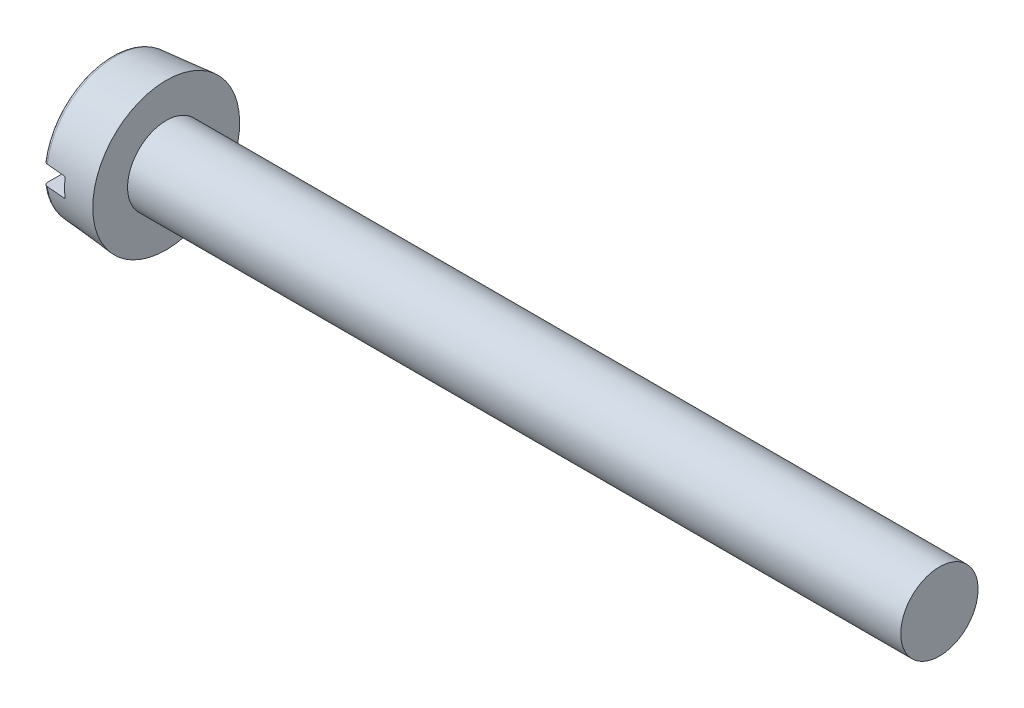
ISO-10303-21;
HEADER;
FILE_DESCRIPTION(('STEP AP214'),'2;1');
FILE_NAME('part.step','',(''),(''),'','','');
FILE_SCHEMA(('AUTOMOTIVE_DESIGN { 1 0 10303 214 1 1 1 1 }'));
ENDSEC;
DATA;
#1=APPLICATION_CONTEXT('core data for automotive mechanical design processes');
#2=APPLICATION_PROTOCOL_DEFINITION('international standard','automotive_design',2000,#1);
#3=PRODUCT_CONTEXT('',#1,'mechanical');
#4=PRODUCT('Part','Part','',(#3));
#5=PRODUCT_RELATED_PRODUCT_CATEGORY('part','',(#4));
#6=PRODUCT_DEFINITION_FORMATION('','',#4);
#7=PRODUCT_DEFINITION_CONTEXT('part definition',#1,'design');
#8=PRODUCT_DEFINITION('design','',#6,#7);
#9=PRODUCT_DEFINITION_SHAPE('','',#8);
#10=(LENGTH_UNIT() NAMED_UNIT(*) SI_UNIT(.MILLI.,.METRE.));
#11=(NAMED_UNIT(*) PLANE_ANGLE_UNIT() SI_UNIT($,.RADIAN.));
#12=(NAMED_UNIT(*) SI_UNIT($,.STERADIAN.) SOLID_ANGLE_UNIT());
#13=UNCERTAINTY_MEASURE_WITH_UNIT(LENGTH_MEASURE(1.E-05),#10,'distance_accuracy_value','');
#14=(GEOMETRIC_REPRESENTATION_CONTEXT(3) GLOBAL_UNCERTAINTY_ASSIGNED_CONTEXT((#13)) GLOBAL_UNIT_ASSIGNED_CONTEXT((#10,
#11,#12)) REPRESENTATION_CONTEXT('',''));
#15=CARTESIAN_POINT('',(0.,0.,0.));
#16=DIRECTION('',(0.,0.,1.));
#17=DIRECTION('',(1.,0.,0.));
#18=AXIS2_PLACEMENT_3D('',#15,#16,#17);
#19=CARTESIAN_POINT('',(0.,0.,0.));
#20=DIRECTION('',(-1.,0.,0.));
#21=DIRECTION('',(0.,0.,1.));
#22=AXIS2_PLACEMENT_3D('',#19,#20,#21);
#23=PLANE('',#22);
#24=DIRECTION('',(0.,0.,-1.));
#25=VECTOR('',#24,1.);
#26=CARTESIAN_POINT('',(0.,0.249999999999999,1.9));
#27=LINE('',#26,#25);
#28=CARTESIAN_POINT('',(0.,0.249999999999999,1.66724343126457));
#29=VERTEX_POINT('',#28);
#30=CARTESIAN_POINT('',(0.,0.249999999999999,-1.66724343126457));
#31=VERTEX_POINT('',#30);
#32=EDGE_CURVE('E103',#29,#31,#27,.T.);
#33=ORIENTED_EDGE('',*,*,#32,.F.);
#34=CARTESIAN_POINT('',(0.,0.,0.));
#35=DIRECTION('',(-1.,0.,0.));
#36=DIRECTION('',(0.,0.,1.));
#37=AXIS2_PLACEMENT_3D('',#34,#35,#36);
#38=CIRCLE('',#37,1.68588275366196);
#39=EDGE_CURVE('E105',#29,#31,#38,.T.);
#40=ORIENTED_EDGE('',*,*,#39,.T.);
#41=EDGE_LOOP('',(#33,#40));
#42=FACE_BOUND('',#41,.T.);
#43=ADVANCED_FACE('F35',(#42),#23,.T.);
#44=CARTESIAN_POINT('',(0.1,0.,0.));
#45=DIRECTION('',(-1.,0.,0.));
#46=DIRECTION('',(0.,0.,1.));
#47=AXIS2_PLACEMENT_3D('',#44,#45,#46);
#48=TOROIDAL_SURFACE('',#47,1.68588275366196,0.1);
#49=CARTESIAN_POINT('',(0.0301239837184532,0.249999999999999,-1.73954570987134));
#50=CARTESIAN_POINT('',(0.0341122540256556,0.249999999999999,-1.74348114703534));
#51=CARTESIAN_POINT('',(0.0384332916495913,0.249999999999999,-1.74708479745269));
#52=CARTESIAN_POINT('',(0.0476215968885684,0.249999999999999,-1.75351988324919));
#53=CARTESIAN_POINT('',(0.0524894518418908,0.249999999999999,-1.75635047687334));
#54=CARTESIAN_POINT('',(0.0626321269057785,0.249999999999999,-1.7611518726827));
#55=CARTESIAN_POINT('',(0.0679068945512793,0.249999999999999,-1.76312278549305));
#56=CARTESIAN_POINT('',(0.078712245471321,0.249999999999999,-1.76614517825523));
#57=CARTESIAN_POINT('',(0.0842427666888282,0.249999999999999,-1.76719688002821));
#58=CARTESIAN_POINT('',(0.0953733944439474,0.249999999999999,-1.76834695503076));
#59=CARTESIAN_POINT('',(0.100972999637237,0.249999999999999,-1.76845018239128));
#60=CARTESIAN_POINT('',(0.112109811915657,0.249999999999999,-1.76771285537891));
#61=CARTESIAN_POINT('',(0.117647018058241,0.249999999999999,-1.76687228676909));
#62=CARTESIAN_POINT('',(0.128489803717953,0.249999999999999,-1.76427538353904));
#63=CARTESIAN_POINT('',(0.133795848010852,0.249999999999999,-1.76252098799906));
#64=CARTESIAN_POINT('',(0.14403973031954,0.249999999999999,-1.75814968615088));
#65=CARTESIAN_POINT('',(0.148977564711526,0.249999999999999,-1.75553277135543));
#66=CARTESIAN_POINT('',(0.158366741694691,0.249999999999999,-1.74950124280131));
#67=CARTESIAN_POINT('',(0.162816088565464,0.249999999999999,-1.74608352334629));
#68=CARTESIAN_POINT('',(0.171083921068067,0.249999999999999,-1.73855542384798));
#69=CARTESIAN_POINT('',(0.174902382724926,0.249999999999999,-1.73444501749311));
#70=CARTESIAN_POINT('',(0.181835504151915,0.249999999999999,-1.72561114445745));
#71=CARTESIAN_POINT('',(0.184943867145123,0.249999999999999,-1.72088273649891));
#72=CARTESIAN_POINT('',(0.190331805109599,0.249999999999999,-1.71097526726483));
#73=CARTESIAN_POINT('',(0.19261133485436,0.249999999999999,-1.7057961814165));
#74=CARTESIAN_POINT('',(0.196300503462131,0.249999999999999,-1.69507883946751));
#75=CARTESIAN_POINT('',(0.197701208750648,0.249999999999999,-1.68953750769915));
#76=CARTESIAN_POINT('',(0.199560107931746,0.249999999999999,-1.67829891478366));
#77=CARTESIAN_POINT('',(0.2000182569785,0.249999999999999,-1.67260164623029));
#78=CARTESIAN_POINT('',(0.199980488082452,0.249999999999999,-1.66116755240173));
#79=CARTESIAN_POINT('',(0.199477416691626,0.249999999999999,-1.65543074959807));
#80=CARTESIAN_POINT('',(0.197516883099685,0.249999999999999,-1.64412247089109));
#81=CARTESIAN_POINT('',(0.19605940106392,0.249999999999999,-1.6385509984262));
#82=CARTESIAN_POINT('',(0.192226434881595,0.249999999999999,-1.62772407078967));
#83=CARTESIAN_POINT('',(0.189849634285873,0.249999999999999,-1.62246908134511));
#84=CARTESIAN_POINT('',(0.184242507962168,0.249999999999999,-1.61243590232117));
#85=CARTESIAN_POINT('',(0.181012200803495,0.249999999999999,-1.60765770237164));
#86=CARTESIAN_POINT('',(0.173808398364609,0.249999999999999,-1.59874552852762));
#87=CARTESIAN_POINT('',(0.16983941365434,0.249999999999999,-1.5946079100141));
#88=CARTESIAN_POINT('',(0.161256212040592,0.249999999999999,-1.58706689346002));
#89=CARTESIAN_POINT('',(0.156642033668646,0.249999999999999,-1.58366345160461));
#90=CARTESIAN_POINT('',(0.146954193747203,0.249999999999999,-1.577728304209));
#91=CARTESIAN_POINT('',(0.141886222152689,0.249999999999999,-1.5751873117397));
#92=CARTESIAN_POINT('',(0.131392256265676,0.249999999999999,-1.57100326499133));
#93=CARTESIAN_POINT('',(0.125966286684049,0.249999999999999,-1.5693601488087));
#94=CARTESIAN_POINT('',(0.114975418023078,0.249999999999999,-1.56703614777695));
#95=CARTESIAN_POINT('',(0.109412743361664,0.249999999999999,-1.56634473553344));
#96=CARTESIAN_POINT('',(0.0982506296477881,0.249999999999999,-1.56591134324024));
#97=CARTESIAN_POINT('',(0.0926511921124145,0.249999999999999,-1.56616932425487));
#98=CARTESIAN_POINT('',(0.0816068018037828,0.249999999999999,-1.56762261837648));
#99=CARTESIAN_POINT('',(0.0761611699810633,0.249999999999999,-1.56881278083001));
#100=CARTESIAN_POINT('',(0.0655461187744442,0.249999999999999,-1.57208782392461));
#101=CARTESIAN_POINT('',(0.0603767005480554,0.249999999999999,-1.5741727083148));
#102=CARTESIAN_POINT('',(0.0504429211594081,0.249999999999999,-1.57918218125947));
#103=CARTESIAN_POINT('',(0.045679818847784,0.249999999999999,-1.58210926476463));
#104=CARTESIAN_POINT('',(0.0367063855830659,0.249999999999999,-1.58871421123321));
#105=CARTESIAN_POINT('',(0.0324960808997949,0.249999999999999,-1.59239210985535));
#106=CARTESIAN_POINT('',(0.0247028499071556,0.249999999999999,-1.60043217731811));
#107=CARTESIAN_POINT('',(0.0211264966781281,0.249999999999999,-1.60480071638002));
#108=CARTESIAN_POINT('',(0.0147478039662305,0.249999999999999,-1.61407035663433));
#109=CARTESIAN_POINT('',(0.0119455146325412,0.249999999999999,-1.61897149230335));
#110=CARTESIAN_POINT('',(0.00716047536747489,0.249999999999999,-1.62922901712882));
#111=CARTESIAN_POINT('',(0.00518773010061188,0.249999999999999,-1.6345900743117));
#112=CARTESIAN_POINT('',(0.00216211004761507,0.249999999999999,-1.64556559292559));
#113=CARTESIAN_POINT('',(0.00110924708522798,0.249999999999999,-1.6511800576128));
#114=CARTESIAN_POINT('',(-5.33425649793595E-05,0.249999999999999,-1.66255157007252));
#115=CARTESIAN_POINT('',(-0.000155417619311162,0.249999999999999,-1.6683094013264));
#116=CARTESIAN_POINT('',(0.000607195995681335,0.249999999999999,-1.67976235656453));
#117=CARTESIAN_POINT('',(0.00147213868127252,0.249999999999999,-1.68545746367547));
#118=CARTESIAN_POINT('',(0.00414869895477077,0.249999999999999,-1.69663068032758));
#119=CARTESIAN_POINT('',(0.00596193608673409,0.249999999999999,-1.70210840133309));
#120=CARTESIAN_POINT('',(0.0104866705202584,0.249999999999999,-1.71267417663621));
#121=CARTESIAN_POINT('',(0.0131970742616457,0.249999999999999,-1.71776269608293));
#122=CARTESIAN_POINT('',(0.0183021368753957,0.249999999999999,-1.72564874312836));
#123=CARTESIAN_POINT('',(0.0204534266755835,0.249999999999999,-1.72860667972899));
#124=CARTESIAN_POINT('',(0.0250639712199927,0.249999999999999,-1.73427200964239));
#125=CARTESIAN_POINT('',(0.0275232249959109,0.249999999999999,-1.73697940374288));
#126=CARTESIAN_POINT('',(0.0301239837184532,0.249999999999999,-1.73954570987134));
#127=B_SPLINE_CURVE_WITH_KNOTS('',3,(#49,#50,#51,#52,#53,#54,#55,#56,#57,#58,#59,#60,#61,#62,
#63,#64,#65,#66,#67,#68,#69,#70,#71,#72,#73,#74,#75,#76,#77,#78,#79,#80,#81,#82,#83,#84,#85,#86,
#87,#88,#89,#90,#91,#92,#93,#94,#95,#96,#97,#98,#99,#100,#101,#102,#103,#104,#105,#106,#107,
#108,#109,#110,#111,#112,#113,#114,#115,#116,#117,#118,#119,#120,#121,#122,#123,#124,#125,#126),
.UNSPECIFIED.,.T.,.F.,(4,2,2,2,2,2,2,2,2,2,2,2,2,2,2,2,2,2,2,2,2,2,2,2,2,2,2,2,2,2,2,2,2,2,2,2,
2,2,4),(0.,0.0167959110445544,0.0336100383184082,0.0504220012837824,0.0672299061172488,
0.083951742734666,0.100673831600297,0.117360580985523,0.134047494574589,0.150800227323111,
0.16755359656452,0.184450209981753,0.201347745249247,0.21841437976708,0.235481826278521,
0.252676784421207,0.269872099922449,0.287092130544962,0.304311786550839,0.321429553193156,
0.338546297983667,0.355472401973107,0.372397338855157,0.389133511649821,0.405868998082989,
0.422512661437951,0.439156394534985,0.455849950224767,0.47254429893197,0.489402732254282,
0.506262257525773,0.523319657239103,0.540377276197228,0.557572051898691,0.574771345386106,
0.59200010906381,0.609207949388039,0.620160629655461,0.631113275486232),.UNSPECIFIED.);
#128=CARTESIAN_POINT('',(0.0912844257252368,0.249999999999999,-1.76791351316188));
#129=VERTEX_POINT('',#128);
#130=EDGE_CURVE('E59',#31,#129,#127,.T.);
#131=ORIENTED_EDGE('',*,*,#130,.F.);
#132=ORIENTED_EDGE('',*,*,#39,.F.);
#133=CARTESIAN_POINT('',(0.0384108200525432,0.249999999999999,1.58753563015566));
#134=CARTESIAN_POINT('',(0.0427902939890953,0.249999999999999,1.58407005650774));
#135=CARTESIAN_POINT('',(0.0474630469549888,0.249999999999999,1.58096901798645));
#136=CARTESIAN_POINT('',(0.0572657439915526,0.249999999999999,1.57559125576911));
#137=CARTESIAN_POINT('',(0.0623961680717357,0.249999999999999,1.57331541051488));
#138=CARTESIAN_POINT('',(0.0729671844638354,0.249999999999999,1.56966008382672));
#139=CARTESIAN_POINT('',(0.0784077499033306,0.249999999999999,1.56828052486143));
#140=CARTESIAN_POINT('',(0.0894424523036429,0.249999999999999,1.56646066317196));
#141=CARTESIAN_POINT('',(0.0950365520436795,0.249999999999999,1.56602013480384));
#142=CARTESIAN_POINT('',(0.106187916851425,0.249999999999999,1.56609100566934));
#143=CARTESIAN_POINT('',(0.111745215600339,0.249999999999999,1.56659719462549));
#144=CARTESIAN_POINT('',(0.122695887603689,0.249999999999999,1.56853573821628));
#145=CARTESIAN_POINT('',(0.128089257112214,0.249999999999999,1.56996811399837));
#146=CARTESIAN_POINT('',(0.138558934280524,0.249999999999999,1.57371510963342));
#147=CARTESIAN_POINT('',(0.143635299693183,0.249999999999999,1.57602956823661));
#148=CARTESIAN_POINT('',(0.153331512379459,0.249999999999999,1.58147155156435));
#149=CARTESIAN_POINT('',(0.15795134553212,0.249999999999999,1.58459910142768));
#150=CARTESIAN_POINT('',(0.166642844689646,0.249999999999999,1.59160307133553));
#151=CARTESIAN_POINT('',(0.170709973240091,0.249999999999999,1.59548512047214));
#152=CARTESIAN_POINT('',(0.178144005385512,0.249999999999999,1.60386991016736));
#153=CARTESIAN_POINT('',(0.181510868111662,0.249999999999999,1.6083726869273));
#154=CARTESIAN_POINT('',(0.187490500087261,0.249999999999999,1.61792751523025));
#155=CARTESIAN_POINT('',(0.190093987175765,0.249999999999999,1.62298537603827));
#156=CARTESIAN_POINT('',(0.1944245750689,0.249999999999999,1.63346332336008));
#157=CARTESIAN_POINT('',(0.196151623655146,0.249999999999999,1.63888343143487));
#158=CARTESIAN_POINT('',(0.19869656706418,0.249999999999999,1.64999030292115));
#159=CARTESIAN_POINT('',(0.19950519348372,0.249999999999999,1.65567919157283));
#160=CARTESIAN_POINT('',(0.200160111365204,0.249999999999999,1.66711218979157));
#161=CARTESIAN_POINT('',(0.200006372625093,0.249999999999999,1.67285630108606));
#162=CARTESIAN_POINT('',(0.198737358913371,0.249999999999999,1.68426056047317));
#163=CARTESIAN_POINT('',(0.197618277112314,0.249999999999999,1.68992028578478));
#164=CARTESIAN_POINT('',(0.194442698747917,0.249999999999999,1.70097049473464));
#165=CARTESIAN_POINT('',(0.192386209487117,0.249999999999999,1.70636098046993));
#166=CARTESIAN_POINT('',(0.187399427297266,0.249999999999999,1.7166994325418));
#167=CARTESIAN_POINT('',(0.184472063094779,0.249999999999999,1.72164881093218));
#168=CARTESIAN_POINT('',(0.177821112560515,0.249999999999999,1.7309802162384));
#169=CARTESIAN_POINT('',(0.174097559800523,0.249999999999999,1.73536226706347));
#170=CARTESIAN_POINT('',(0.165993769608674,0.249999999999999,1.74339353418511));
#171=CARTESIAN_POINT('',(0.161619482864613,0.249999999999999,1.74704875411543));
#172=CARTESIAN_POINT('',(0.152314080979336,0.249999999999999,1.75356401214195));
#173=CARTESIAN_POINT('',(0.147382997277304,0.249999999999999,1.75642409510351));
#174=CARTESIAN_POINT('',(0.137157313470634,0.249999999999999,1.76123793804063));
#175=CARTESIAN_POINT('',(0.131866864335231,0.249999999999999,1.76320051691167));
#176=CARTESIAN_POINT('',(0.121030177928265,0.249999999999999,1.7662021188539));
#177=CARTESIAN_POINT('',(0.115483952770111,0.249999999999999,1.76724118561497));
#178=CARTESIAN_POINT('',(0.104337264218609,0.249999999999999,1.76836005573213));
#179=CARTESIAN_POINT('',(0.0987375081693254,0.249999999999999,1.76844691644335));
#180=CARTESIAN_POINT('',(0.0876033192585386,0.249999999999999,1.76767711814466));
#181=CARTESIAN_POINT('',(0.0820688850795541,0.249999999999999,1.76682047819726));
#182=CARTESIAN_POINT('',(0.0712339359121821,0.249999999999999,1.76419215705386));
#183=CARTESIAN_POINT('',(0.065932964474412,0.249999999999999,1.76242235604695));
#184=CARTESIAN_POINT('',(0.0557017028644439,0.249999999999999,1.75802135089928));
#185=CARTESIAN_POINT('',(0.0507714167878421,0.249999999999999,1.75539013724272));
#186=CARTESIAN_POINT('',(0.0413993898846338,0.249999999999999,1.74933132383135));
#187=CARTESIAN_POINT('',(0.0369596773547094,0.249999999999999,1.74590058763537));
#188=CARTESIAN_POINT('',(0.0287131089970529,0.249999999999999,1.73834824703872));
#189=CARTESIAN_POINT('',(0.024906279451321,0.249999999999999,1.73422661396116));
#190=CARTESIAN_POINT('',(0.0179981143560022,0.249999999999999,1.72537218244404));
#191=CARTESIAN_POINT('',(0.0149031090922601,0.249999999999999,1.72063444579746));
#192=CARTESIAN_POINT('',(0.00954325096840203,0.249999999999999,1.71071066098417));
#193=CARTESIAN_POINT('',(0.0072784442605487,0.249999999999999,1.70552458791341));
#194=CARTESIAN_POINT('',(0.00361981721141317,0.249999999999999,1.69479566620519));
#195=CARTESIAN_POINT('',(0.00223495300327888,0.249999999999999,1.68924976295691));
#196=CARTESIAN_POINT('',(0.000408375366710367,0.249999999999999,1.67800493025775));
#197=CARTESIAN_POINT('',(-3.33291319019932E-05,0.249999999999999,1.67230599935852));
#198=CARTESIAN_POINT('',(3.75123327413514E-05,0.249999999999999,1.66087218591111));
#199=CARTESIAN_POINT('',(0.000557074784948425,0.249999999999999,1.65513734594055));
#200=CARTESIAN_POINT('',(0.00255033342308924,0.249999999999999,1.64383422369473));
#201=CARTESIAN_POINT('',(0.00402428246581646,0.249999999999999,1.63826598596849));
#202=CARTESIAN_POINT('',(0.00788999970877085,0.249999999999999,1.62744650084934));
#203=CARTESIAN_POINT('',(0.0102834602468336,0.249999999999999,1.62219585873013));
#204=CARTESIAN_POINT('',(0.0159217046243912,0.249999999999999,1.61217899485774));
#205=CARTESIAN_POINT('',(0.0191654522683335,0.249999999999999,1.607412193218));
#206=CARTESIAN_POINT('',(0.0251008031700798,0.249999999999999,1.60011257766084));
#207=CARTESIAN_POINT('',(0.0275686339076148,0.249999999999999,1.59739475707804));
#208=CARTESIAN_POINT('',(0.0327857649139939,0.249999999999999,1.59224410808593));
#209=CARTESIAN_POINT('',(0.0355350642370451,0.249999999999999,1.58981127871903));
#210=CARTESIAN_POINT('',(0.0384108200525432,0.249999999999999,1.58753563015566));
#211=B_SPLINE_CURVE_WITH_KNOTS('',3,(#133,#134,#135,#136,#137,#138,#139,#140,#141,#142,#143,
#144,#145,#146,#147,#148,#149,#150,#151,#152,#153,#154,#155,#156,#157,#158,#159,#160,#161,#162,
#163,#164,#165,#166,#167,#168,#169,#170,#171,#172,#173,#174,#175,#176,#177,#178,#179,#180,#181,
#182,#183,#184,#185,#186,#187,#188,#189,#190,#191,#192,#193,#194,#195,#196,#197,#198,#199,#200,
#201,#202,#203,#204,#205,#206,#207,#208,#209,#210),.UNSPECIFIED.,.T.,.F.,(4,2,2,2,2,2,2,2,2,2,2,
2,2,2,2,2,2,2,2,2,2,2,2,2,2,2,2,2,2,2,2,2,2,2,2,2,2,2,4),(0.,0.0167411910060397,
0.0335001515260868,0.0502576621545584,0.0670111455902062,0.0836726971117885,0.10033462907698,
0.116993516605719,0.133652919247718,0.150441746179846,0.167231552664634,0.184217767175993,
0.201204993610689,0.218362167205907,0.235519879250063,0.252745563649486,0.269971113860594,
0.287139377595869,0.304306917563326,0.321326154497721,0.338344430931905,0.355191689226128,
0.37203815046139,0.388759667571552,0.405480846845857,0.422167733967673,0.438854805431025,
0.455608474446361,0.472362839024728,0.489260888718256,0.50615987766299,0.523228221442542,
0.540296726824197,0.557490310608039,0.574688451553919,0.591918398070691,0.609127444285943,
0.620120485883896,0.631113490544151),.UNSPECIFIED.);
#212=CARTESIAN_POINT('',(0.0912844257209504,0.249999999999999,1.76791351317857));
#213=VERTEX_POINT('',#212);
#214=EDGE_CURVE('E95',#213,#29,#211,.T.);
#215=ORIENTED_EDGE('',*,*,#214,.F.);
#216=CARTESIAN_POINT('',(0.0912844257252368,0.,0.));
#217=DIRECTION('',(-1.,0.,0.));
#218=DIRECTION('',(0.,0.,1.));
#219=AXIS2_PLACEMENT_3D('',#216,#217,#218);
#220=CIRCLE('',#219,1.78550222347114);
#221=EDGE_CURVE('E109',#129,#213,#220,.F.);
#222=ORIENTED_EDGE('',*,*,#221,.F.);
#223=EDGE_LOOP('',(#131,#132,#215,#222));
#224=FACE_BOUND('',#223,.T.);
#225=ADVANCED_FACE('F179',(#224),#48,.T.);
#226=CARTESIAN_POINT('',(-25.4,0.,0.));
#227=DIRECTION('',(-1.,0.,0.));
#228=DIRECTION('',(0.,0.,1.));
#229=AXIS2_PLACEMENT_3D('',#226,#227,#228);
#230=CYLINDRICAL_SURFACE('',#229,1.);
#231=CARTESIAN_POINT('',(21.4,0.,0.));
#232=DIRECTION('',(-1.,0.,0.));
#233=DIRECTION('',(0.,0.,1.));
#234=AXIS2_PLACEMENT_3D('',#231,#232,#233);
#235=CIRCLE('',#234,1.);
#236=CARTESIAN_POINT('',(21.4,0.,1.));
#237=VERTEX_POINT('',#236);
#238=EDGE_CURVE('E167',#237,#237,#235,.T.);
#239=ORIENTED_EDGE('',*,*,#238,.T.);
#240=EDGE_LOOP('',(#239));
#241=FACE_BOUND('',#240,.T.);
#242=CARTESIAN_POINT('',(1.4,0.,0.));
#243=DIRECTION('',(-1.,0.,0.));
#244=DIRECTION('',(0.,0.,1.));
#245=AXIS2_PLACEMENT_3D('',#242,#243,#244);
#246=CIRCLE('',#245,1.);
#247=CARTESIAN_POINT('',(1.4,0.,1.));
#248=VERTEX_POINT('',#247);
#249=EDGE_CURVE('E106',#248,#248,#246,.T.);
#250=ORIENTED_EDGE('',*,*,#249,.F.);
#251=EDGE_LOOP('',(#250));
#252=FACE_BOUND('',#251,.T.);
#253=ADVANCED_FACE('F175',(#241,#252),#230,.T.);
#254=CARTESIAN_POINT('',(1.4,1.,0.));
#255=DIRECTION('',(-1.,0.,0.));
#256=DIRECTION('',(0.,0.,1.));
#257=AXIS2_PLACEMENT_3D('',#254,#255,#256);
#258=PLANE('',#257);
#259=CARTESIAN_POINT('',(1.4,0.,0.));
#260=DIRECTION('',(-1.,0.,0.));
#261=DIRECTION('',(0.,0.,1.));
#262=AXIS2_PLACEMENT_3D('',#259,#260,#261);
#263=CIRCLE('',#262,1.9);
#264=CARTESIAN_POINT('',(1.4,0.,1.9));
#265=VERTEX_POINT('',#264);
#266=EDGE_CURVE('E111',#265,#265,#263,.T.);
#267=ORIENTED_EDGE('',*,*,#266,.F.);
#268=EDGE_LOOP('',(#267));
#269=FACE_BOUND('',#268,.T.);
#270=ORIENTED_EDGE('',*,*,#249,.T.);
#271=EDGE_LOOP('',(#270));
#272=FACE_BOUND('',#271,.T.);
#273=ADVANCED_FACE('F152',(#269,#272),#258,.F.);
#274=CARTESIAN_POINT('',(0.,0.,0.));
#275=DIRECTION('',(1.,0.,0.));
#276=DIRECTION('',(0.,0.,-1.));
#277=AXIS2_PLACEMENT_3D('',#274,#275,#276);
#278=CONICAL_SURFACE('',#277,1.77751587106371,0.0872664625997168);
#279=CARTESIAN_POINT('',(3.62107818810661,0.249999999999999,2.07934430853245));
#280=CARTESIAN_POINT('',(3.06980125604965,0.249999999999999,2.03076587392467));
#281=CARTESIAN_POINT('',(2.51852633750628,0.249999999999999,1.98216457470873));
#282=CARTESIAN_POINT('',(1.41598182372261,0.249999999999999,1.88490176224617));
#283=CARTESIAN_POINT('',(0.864712228482192,0.249999999999999,1.83624024900076));
#284=CARTESIAN_POINT('',(-0.237820369493234,0.249999999999999,1.7388425212793));
#285=CARTESIAN_POINT('',(-0.789083372228186,0.249999999999999,1.69010630680258));
#286=CARTESIAN_POINT('',(-1.89160065704932,0.249999999999999,1.59253521876818));
#287=CARTESIAN_POINT('',(-2.44285493913533,0.249999999999999,1.5437003452085));
#288=CARTESIAN_POINT('',(-2.99410378813087,0.249999999999999,1.49480416395094));
#289=B_SPLINE_CURVE_WITH_KNOTS('',3,(#279,#280,#281,#282,#283,#284,#285,#286,#287,#288),
.UNSPECIFIED.,.F.,.F.,(4,2,2,2,4),(0.,1.66023946632278,3.32047889930815,4.98071834715392,
6.64095782861457),.UNSPECIFIED.);
#290=CARTESIAN_POINT('',(0.6,0.249999999999999,1.8128522259904));
#291=VERTEX_POINT('',#290);
#292=EDGE_CURVE('E158',#291,#213,#289,.T.);
#293=ORIENTED_EDGE('',*,*,#292,.F.);
#294=CARTESIAN_POINT('',(0.6,0.,0.));
#295=DIRECTION('',(1.,0.,0.));
#296=DIRECTION('',(0.,0.,-1.));
#297=AXIS2_PLACEMENT_3D('',#294,#295,#296);
#298=CIRCLE('',#297,1.83000906917926);
#299=CARTESIAN_POINT('',(0.6,-0.25,1.8128522259904));
#300=VERTEX_POINT('',#299);
#301=EDGE_CURVE('E11',#300,#291,#298,.F.);
#302=ORIENTED_EDGE('',*,*,#301,.F.);
#303=CARTESIAN_POINT('',(-2.99410378813087,-0.25,1.49480416395094));
#304=CARTESIAN_POINT('',(-2.06836137178342,-0.25,1.57691372931172));
#305=CARTESIAN_POINT('',(-1.14260434025588,-0.25,1.65885820727604));
#306=CARTESIAN_POINT('',(-0.0400762748424799,-0.25,1.75630736694366));
#307=CARTESIAN_POINT('',(0.136684651711362,-0.25,1.77192637736924));
#308=CARTESIAN_POINT('',(1.41597857948217,-0.250000000000001,1.88493859856276));
#309=CARTESIAN_POINT('',(2.51852498766335,-0.250000000000001,1.98218009580805));
#310=CARTESIAN_POINT('',(3.62107818810661,-0.25,2.07934430853245));
#311=B_SPLINE_CURVE_WITH_KNOTS('',3,(#303,#304,#305,#306,#307,#308,#309,#310),.UNSPECIFIED.,.F.,
.F.,(4,2,2,4),(0.,2.78812996950874,3.32047892237668,6.64095781673274),.UNSPECIFIED.);
#312=CARTESIAN_POINT('',(0.0912844257252368,-0.25,1.76791351316188));
#313=VERTEX_POINT('',#312);
#314=EDGE_CURVE('E136',#313,#300,#311,.T.);
#315=ORIENTED_EDGE('',*,*,#314,.F.);
#316=CARTESIAN_POINT('',(0.0912844257205114,-0.25,-1.76791351318017));
#317=VERTEX_POINT('',#316);
#318=EDGE_CURVE('E115',#313,#317,#220,.F.);
#319=ORIENTED_EDGE('',*,*,#318,.T.);
#320=CARTESIAN_POINT('',(3.62107818810661,-0.25,-2.07934430853245));
#321=CARTESIAN_POINT('',(3.06980125604965,-0.25,-2.03076587392467));
#322=CARTESIAN_POINT('',(2.51852633750628,-0.25,-1.98216457470873));
#323=CARTESIAN_POINT('',(1.41598182372261,-0.25,-1.88490176224617));
#324=CARTESIAN_POINT('',(0.864712228482192,-0.25,-1.83624024900076));
#325=CARTESIAN_POINT('',(-0.237820369493234,-0.25,-1.7388425212793));
#326=CARTESIAN_POINT('',(-0.789083372228186,-0.25,-1.69010630680258));
#327=CARTESIAN_POINT('',(-1.89160065704932,-0.25,-1.59253521876818));
#328=CARTESIAN_POINT('',(-2.44285493913533,-0.25,-1.5437003452085));
#329=CARTESIAN_POINT('',(-2.99410378813087,-0.25,-1.49480416395094));
#330=B_SPLINE_CURVE_WITH_KNOTS('',3,(#320,#321,#322,#323,#324,#325,#326,#327,#328,#329),
.UNSPECIFIED.,.F.,.F.,(4,2,2,2,4),(0.,1.66023946632278,3.32047889930815,4.98071834715392,
6.64095782861457),.UNSPECIFIED.);
#331=CARTESIAN_POINT('',(0.6,-0.25,-1.8128522259904));
#332=VERTEX_POINT('',#331);
#333=EDGE_CURVE('E90',#332,#317,#330,.T.);
#334=ORIENTED_EDGE('',*,*,#333,.F.);
#335=CARTESIAN_POINT('',(0.6,0.249999999999999,-1.8128522259904));
#336=VERTEX_POINT('',#335);
#337=EDGE_CURVE('E40',#336,#332,#298,.F.);
#338=ORIENTED_EDGE('',*,*,#337,.F.);
#339=CARTESIAN_POINT('',(-2.99410378813087,0.249999999999999,-1.49480416395094));
#340=CARTESIAN_POINT('',(-2.06836137178342,0.249999999999999,-1.57691372931172));
#341=CARTESIAN_POINT('',(-1.14260434025588,0.249999999999999,-1.65885820727604));
#342=CARTESIAN_POINT('',(-0.0400762748424797,0.249999999999999,-1.75630736694366));
#343=CARTESIAN_POINT('',(0.136684651711362,0.249999999999999,-1.77192637736924));
#344=CARTESIAN_POINT('',(1.41597857948217,0.249999999999999,-1.88493859856276));
#345=CARTESIAN_POINT('',(2.51852498766334,0.249999999999999,-1.98218009580805));
#346=CARTESIAN_POINT('',(3.62107818810661,0.249999999999999,-2.07934430853245));
#347=B_SPLINE_CURVE_WITH_KNOTS('',3,(#339,#340,#341,#342,#343,#344,#345,#346),.UNSPECIFIED.,.F.,
.F.,(4,2,2,4),(0.,2.78812996950874,3.32047892237668,6.64095781673274),.UNSPECIFIED.);
#348=EDGE_CURVE('E162',#129,#336,#347,.T.);
#349=ORIENTED_EDGE('',*,*,#348,.F.);
#350=ORIENTED_EDGE('',*,*,#221,.T.);
#351=EDGE_LOOP('',(#293,#302,#315,#319,#334,#338,#349,#350));
#352=FACE_BOUND('',#351,.T.);
#353=ORIENTED_EDGE('',*,*,#266,.T.);
#354=EDGE_LOOP('',(#353));
#355=FACE_BOUND('',#354,.T.);
#356=ADVANCED_FACE('F147',(#352,#355),#278,.T.);
#357=DIRECTION('',(0.,0.,1.));
#358=VECTOR('',#357,1.);
#359=CARTESIAN_POINT('',(0.,-0.25,-1.9));
#360=LINE('',#359,#358);
#361=CARTESIAN_POINT('',(0.,-0.25,-1.66724343126457));
#362=VERTEX_POINT('',#361);
#363=CARTESIAN_POINT('',(0.,-0.25,1.66724343126457));
#364=VERTEX_POINT('',#363);
#365=EDGE_CURVE('E51',#362,#364,#360,.T.);
#366=ORIENTED_EDGE('',*,*,#365,.F.);
#367=EDGE_CURVE('E101',#362,#364,#38,.T.);
#368=ORIENTED_EDGE('',*,*,#367,.T.);
#369=EDGE_LOOP('',(#366,#368));
#370=FACE_BOUND('',#369,.T.);
#371=ADVANCED_FACE('F100',(#370),#23,.T.);
#372=CARTESIAN_POINT('',(21.4,1.,0.));
#373=DIRECTION('',(1.,0.,0.));
#374=DIRECTION('',(0.,0.,-1.));
#375=AXIS2_PLACEMENT_3D('',#372,#373,#374);
#376=PLANE('',#375);
#377=ORIENTED_EDGE('',*,*,#238,.F.);
#378=EDGE_LOOP('',(#377));
#379=FACE_BOUND('',#378,.T.);
#380=ADVANCED_FACE('F191',(#379),#376,.T.);
#381=CARTESIAN_POINT('',(0.0301239837184532,-0.25,-1.73954570987134));
#382=CARTESIAN_POINT('',(0.0260780259282714,-0.25,-1.7355526396478));
#383=CARTESIAN_POINT('',(0.0223687128122041,-0.25,-1.73121218004398));
#384=CARTESIAN_POINT('',(0.015730263913143,-0.25,-1.72196511132148));
#385=CARTESIAN_POINT('',(0.0128021718532192,-0.25,-1.71705775723464));
#386=CARTESIAN_POINT('',(0.00781155963394526,-0.25,-1.70682606234138));
#387=CARTESIAN_POINT('',(0.00574827888609318,-0.25,-1.70150209285375));
#388=CARTESIAN_POINT('',(0.0025389033246818,-0.25,-1.69058637396543));
#389=CARTESIAN_POINT('',(0.00139257748788467,-0.25,-1.68499469239027));
#390=CARTESIAN_POINT('',(4.1028290894576E-05,-0.25,-1.6736612271434));
#391=CARTESIAN_POINT('',(-0.000157937515953992,-0.25,-1.66791869666335));
#392=CARTESIAN_POINT('',(0.000406868333239554,-0.25,-1.65648081813977));
#393=CARTESIAN_POINT('',(0.00117071281055936,-0.25,-1.6507854736979));
#394=CARTESIAN_POINT('',(0.00364543682274032,-0.25,-1.63958072861034));
#395=CARTESIAN_POINT('',(0.00536002222944682,-0.25,-1.63407214566351));
#396=CARTESIAN_POINT('',(0.00969258991345407,-0.25,-1.62342232819609));
#397=CARTESIAN_POINT('',(0.0123105654239291,-0.25,-1.61828109092426));
#398=CARTESIAN_POINT('',(0.0183686871454054,-0.25,-1.60853152324288));
#399=CARTESIAN_POINT('',(0.0218060998642163,-0.25,-1.60392149509216));
#400=CARTESIAN_POINT('',(0.0294130618130881,-0.25,-1.59535108561564));
#401=CARTESIAN_POINT('',(0.0335825743199976,-0.25,-1.59139067172354));
#402=CARTESIAN_POINT('',(0.0424928099447951,-0.25,-1.58427405023075));
#403=CARTESIAN_POINT('',(0.0472275909660953,-0.25,-1.58111040437777));
#404=CARTESIAN_POINT('',(0.0571661220583315,-0.25,-1.57563408783813));
#405=CARTESIAN_POINT('',(0.0623698398595648,-0.25,-1.57332135865154));
#406=CARTESIAN_POINT('',(0.0730321903589686,-0.25,-1.56964075335714));
#407=CARTESIAN_POINT('',(0.0784870693494749,-0.25,-1.5682620002125));
#408=CARTESIAN_POINT('',(0.0895514615468659,-0.25,-1.56644822093411));
#409=CARTESIAN_POINT('',(0.0951609661759992,-0.25,-1.56601314255693));
#410=CARTESIAN_POINT('',(0.106327002489757,-0.25,-1.56609980469677));
#411=CARTESIAN_POINT('',(0.111883595726443,-0.25,-1.56661383635248));
#412=CARTESIAN_POINT('',(0.122831388816504,-0.25,-1.56856777941325));
#413=CARTESIAN_POINT('',(0.128222590680127,-0.25,-1.57000767956016));
#414=CARTESIAN_POINT('',(0.138686958017418,-0.25,-1.57376928649222));
#415=CARTESIAN_POINT('',(0.143760167134577,-0.25,-1.57609087195875));
#416=CARTESIAN_POINT('',(0.153448951544548,-0.25,-1.58154646534634));
#417=CARTESIAN_POINT('',(0.158064511721777,-0.25,-1.58468050008924));
#418=CARTESIAN_POINT('',(0.166746542197496,-0.25,-1.59169675607619));
#419=CARTESIAN_POINT('',(0.170808452559136,-0.25,-1.59558461824979));
#420=CARTESIAN_POINT('',(0.178231167530173,-0.25,-1.60398009132926));
#421=CARTESIAN_POINT('',(0.181591930079707,-0.25,-1.60848773938744));
#422=CARTESIAN_POINT('',(0.187558577382552,-0.25,-1.61805131058344));
#423=CARTESIAN_POINT('',(0.190155167963792,-0.25,-1.62311303257518));
#424=CARTESIAN_POINT('',(0.194471398021902,-0.25,-1.63359750325318));
#425=CARTESIAN_POINT('',(0.196190986225804,-0.25,-1.63902027302674));
#426=CARTESIAN_POINT('',(0.198720541525037,-0.25,-1.6501311220685));
#427=CARTESIAN_POINT('',(0.199521253042963,-0.25,-1.65582131006131));
#428=CARTESIAN_POINT('',(0.200160205109374,-0.25,-1.66725556951254));
#429=CARTESIAN_POINT('',(0.199998414852101,-0.25,-1.67299964268973));
#430=CARTESIAN_POINT('',(0.198713360352002,-0.25,-1.68440229675822));
#431=CARTESIAN_POINT('',(0.197586318442358,-0.25,-1.6900604527342));
#432=CARTESIAN_POINT('',(0.194395171653612,-0.25,-1.70110618713494));
#433=CARTESIAN_POINT('',(0.192331075364088,-0.25,-1.70649376803945));
#434=CARTESIAN_POINT('',(0.187329743049283,-0.25,-1.71682501034087));
#435=CARTESIAN_POINT('',(0.184395458897692,-0.25,-1.7217701001031));
#436=CARTESIAN_POINT('',(0.177731477244739,-0.25,-1.73109181693493));
#437=CARTESIAN_POINT('',(0.174001811840986,-0.25,-1.73546846693245));
#438=CARTESIAN_POINT('',(0.165886911198511,-0.25,-1.74348794106844));
#439=CARTESIAN_POINT('',(0.161507629441039,-0.25,-1.74713678874591));
#440=CARTESIAN_POINT('',(0.152193383444687,-0.25,-1.75363855606621));
#441=CARTESIAN_POINT('',(0.147258449475752,-0.25,-1.75649151903657));
#442=CARTESIAN_POINT('',(0.137026259848383,-0.25,-1.76129070832175));
#443=CARTESIAN_POINT('',(0.131733133431452,-0.25,-1.76324573979348));
#444=CARTESIAN_POINT('',(0.120892616958678,-0.25,-1.76623183391573));
#445=CARTESIAN_POINT('',(0.115345249136052,-0.25,-1.76726297719811));
#446=CARTESIAN_POINT('',(0.104198164295005,-0.25,-1.76836600998605));
#447=CARTESIAN_POINT('',(0.0985991525060406,-0.25,-1.76844503986814));
#448=CARTESIAN_POINT('',(0.0874662076269187,-0.25,-1.76765975687259));
#449=CARTESIAN_POINT('',(0.0819322899786194,-0.25,-1.76679522454642));
#450=CARTESIAN_POINT('',(0.071097401418532,-0.25,-1.76415096656149));
#451=CARTESIAN_POINT('',(0.065796084214597,-0.25,-1.76237265523513));
#452=CARTESIAN_POINT('',(0.0555703957728289,-0.25,-1.75795545669432));
#453=CARTESIAN_POINT('',(0.0506455770568978,-0.25,-1.75531761132611));
#454=CARTESIAN_POINT('',(0.0431273776562815,-0.25,-1.75044285417604));
#455=CARTESIAN_POINT('',(0.0403727951884059,-0.25,-1.74844968976037));
#456=CARTESIAN_POINT('',(0.0350800601103014,-0.25,-1.74419427547474));
#457=CARTESIAN_POINT('',(0.0325419067549649,-0.25,-1.74193202653123));
#458=CARTESIAN_POINT('',(0.0301239837184532,-0.25,-1.73954570987134));
#459=B_SPLINE_CURVE_WITH_KNOTS('',3,(#381,#382,#383,#384,#385,#386,#387,#388,#389,#390,#391,
#392,#393,#394,#395,#396,#397,#398,#399,#400,#401,#402,#403,#404,#405,#406,#407,#408,#409,#410,
#411,#412,#413,#414,#415,#416,#417,#418,#419,#420,#421,#422,#423,#424,#425,#426,#427,#428,#429,
#430,#431,#432,#433,#434,#435,#436,#437,#438,#439,#440,#441,#442,#443,#444,#445,#446,#447,#448,
#449,#450,#451,#452,#453,#454,#455,#456,#457,#458),.UNSPECIFIED.,.T.,.F.,(4,2,2,2,2,2,2,2,2,2,2,
2,2,2,2,2,2,2,2,2,2,2,2,2,2,2,2,2,2,2,2,2,2,2,2,2,2,2,4),(0.,0.017041172243894,
0.0341049990186796,0.0511537867645733,0.0681982777803316,0.0853551972527305,0.102513414450953,
0.119738987255987,0.136964431036009,0.154133198727651,0.17130110545575,0.188302245400992,
0.205302216311466,0.222100636581184,0.238898126838039,0.25555978426519,0.272221239097884,
0.288880402169165,0.305540115289018,0.322329672912014,0.339120237403425,0.356107292735504,
0.373095341083041,0.390253043299335,0.407411294666674,0.424637006068489,0.441862559572752,
0.459030335786743,0.476197419326211,0.493215918450514,0.510233490915955,0.527080425228571,
0.543925889090264,0.560644941023429,0.577367882210947,0.594065017517698,0.610741988948957,
0.620926075619136,0.631110127226808),.UNSPECIFIED.);
#460=EDGE_CURVE('E86',#317,#362,#459,.T.);
#461=ORIENTED_EDGE('',*,*,#460,.F.);
#462=ORIENTED_EDGE('',*,*,#318,.F.);
#463=CARTESIAN_POINT('',(0.0384108200525431,-0.25,1.58753563015566));
#464=CARTESIAN_POINT('',(0.0339573950704062,-0.25,1.5910603658954));
#465=CARTESIAN_POINT('',(0.0298007999429173,-0.25,1.59496730933873));
#466=CARTESIAN_POINT('',(0.0222010182064336,-0.25,1.60342863634491));
#467=CARTESIAN_POINT('',(0.0187588035663531,-0.25,1.60798388796708));
#468=CARTESIAN_POINT('',(0.0126884755380016,-0.25,1.61760223594505));
#469=CARTESIAN_POINT('',(0.0100595998475482,-0.25,1.62266485084517));
#470=CARTESIAN_POINT('',(0.00568272388268365,-0.25,1.63315559353335));
#471=CARTESIAN_POINT('',(0.0039344989316744,-0.25,1.63858362769256));
#472=CARTESIAN_POINT('',(0.00135420896618546,-0.25,1.6496959787203));
#473=CARTESIAN_POINT('',(0.00052906249314248,-0.25,1.65538190290297));
#474=CARTESIAN_POINT('',(-0.000159268616023119,-0.25,1.66681204026049));
#475=CARTESIAN_POINT('',(-2.23806129212399E-05,-0.25,1.67255625780414));
#476=CARTESIAN_POINT('',(0.00121306917338683,-0.25,1.68396387537009));
#477=CARTESIAN_POINT('',(0.00231549071302757,-0.25,1.68962685820058));
#478=CARTESIAN_POINT('',(0.00545847496257994,-0.25,1.70068635267493));
#479=CARTESIAN_POINT('',(0.0074990287056838,-0.25,1.70608286686519));
#480=CARTESIAN_POINT('',(0.0124553209196927,-0.25,1.71643631844882));
#481=CARTESIAN_POINT('',(0.0153681805259015,-0.25,1.72139463336573));
#482=CARTESIAN_POINT('',(0.0219918139097583,-0.25,1.73074625136145));
#483=CARTESIAN_POINT('',(0.0257025525730674,-0.25,1.73513957929153));
#484=CARTESIAN_POINT('',(0.0337830293566342,-0.25,1.7431954661646));
#485=CARTESIAN_POINT('',(0.0381468204499068,-0.25,1.74686398949027));
#486=CARTESIAN_POINT('',(0.0474336489372384,-0.25,1.7534074422751));
#487=CARTESIAN_POINT('',(0.0523566554179295,-0.25,1.75628241557152));
#488=CARTESIAN_POINT('',(0.0625688825799931,-0.25,1.76112700539213));
#489=CARTESIAN_POINT('',(0.0678539229214086,-0.25,1.76310543520284));
#490=CARTESIAN_POINT('',(0.0786825580230994,-0.25,1.76613938813517));
#491=CARTESIAN_POINT('',(0.0842261404099094,-0.25,1.76719495537608));
#492=CARTESIAN_POINT('',(0.0953701815790081,-0.25,1.76834682813952));
#493=CARTESIAN_POINT('',(0.100969908426044,-0.25,1.76845022511559));
#494=CARTESIAN_POINT('',(0.112106813064689,-0.25,1.76771321576232));
#495=CARTESIAN_POINT('',(0.117643992150452,-0.25,1.76687282899673));
#496=CARTESIAN_POINT('',(0.128486801349998,-0.25,1.76427628463559));
#497=CARTESIAN_POINT('',(0.133792894145407,-0.25,1.76252205760683));
#498=CARTESIAN_POINT('',(0.144036912707969,-0.25,1.75815107926835));
#499=CARTESIAN_POINT('',(0.148974834149097,-0.25,1.75553431782577));
#500=CARTESIAN_POINT('',(0.15836419767094,-0.25,1.74950308538222));
#501=CARTESIAN_POINT('',(0.162813645288571,-0.25,1.74608551042966));
#502=CARTESIAN_POINT('',(0.171081709116823,-0.25,1.73855767538295));
#503=CARTESIAN_POINT('',(0.174900300331173,-0.25,1.73444738785466));
#504=CARTESIAN_POINT('',(0.18183369697909,-0.25,1.72561373225442));
#505=CARTESIAN_POINT('',(0.184942206210862,-0.25,1.72088542303857));
#506=CARTESIAN_POINT('',(0.190330447701009,-0.25,1.7109781307854));
#507=CARTESIAN_POINT('',(0.192610135624697,-0.25,1.70579912365806));
#508=CARTESIAN_POINT('',(0.19629963411489,-0.25,1.69508191169097));
#509=CARTESIAN_POINT('',(0.197700511048479,-0.25,1.68954063085116));
#510=CARTESIAN_POINT('',(0.199559761114849,-0.25,1.67830210616433));
#511=CARTESIAN_POINT('',(0.200018088664459,-0.25,1.67260485478783));
#512=CARTESIAN_POINT('',(0.19998067881951,-0.25,1.66117076172758));
#513=CARTESIAN_POINT('',(0.199477787367227,-0.25,1.65543394229265));
#514=CARTESIAN_POINT('',(0.197517609613423,-0.25,1.64412560727951));
#515=CARTESIAN_POINT('',(0.19606030463383,-0.25,1.63855409493864));
#516=CARTESIAN_POINT('',(0.192227684515839,-0.25,1.62772705594972));
#517=CARTESIAN_POINT('',(0.189851052632654,-0.25,1.62247199508646));
#518=CARTESIAN_POINT('',(0.184244245083918,-0.25,1.6124386350999));
#519=CARTESIAN_POINT('',(0.181014086328864,-0.25,1.60766032653354));
#520=CARTESIAN_POINT('',(0.173810564074661,-0.25,1.59874791823183));
#521=CARTESIAN_POINT('',(0.169841712242575,-0.25,1.59461017322819));
#522=CARTESIAN_POINT('',(0.161258744744243,-0.25,1.58706887510163));
#523=CARTESIAN_POINT('',(0.156644666353809,-0.25,1.58366527959454));
#524=CARTESIAN_POINT('',(0.146956906135104,-0.25,1.57772975331653));
#525=CARTESIAN_POINT('',(0.141888904809587,-0.25,1.57518855169054));
#526=CARTESIAN_POINT('',(0.131395039843866,-0.25,1.57100420461337));
#527=CARTESIAN_POINT('',(0.125969215308606,-0.25,1.5693609612099));
#528=CARTESIAN_POINT('',(0.114979237434394,-0.25,1.56703676449653));
#529=CARTESIAN_POINT('',(0.109417329315998,-0.25,1.56634518516968));
#530=CARTESIAN_POINT('',(0.0982551532904774,-0.25,1.56591124754994));
#531=CARTESIAN_POINT('',(0.0926548774749356,-0.25,1.56616909121188));
#532=CARTESIAN_POINT('',(0.0816066443551732,-0.25,1.56762238853903));
#533=CARTESIAN_POINT('',(0.0761580649375369,-0.25,1.5688131425548));
#534=CARTESIAN_POINT('',(0.0655421563582807,-0.25,1.57208964252859));
#535=CARTESIAN_POINT('',(0.060374492663995,-0.25,1.57417429644248));
#536=CARTESIAN_POINT('',(0.0524104046253596,-0.25,1.57818971720466));
#537=CARTESIAN_POINT('',(0.0494794583378912,-0.25,1.57985966161506));
#538=CARTESIAN_POINT('',(0.0438011029424254,-0.25,1.583486746576));
#539=CARTESIAN_POINT('',(0.0410536927850418,-0.25,1.58544388548427));
#540=CARTESIAN_POINT('',(0.0384108200525431,-0.25,1.58753563015566));
#541=B_SPLINE_CURVE_WITH_KNOTS('',3,(#463,#464,#465,#466,#467,#468,#469,#470,#471,#472,#473,
#474,#475,#476,#477,#478,#479,#480,#481,#482,#483,#484,#485,#486,#487,#488,#489,#490,#491,#492,
#493,#494,#495,#496,#497,#498,#499,#500,#501,#502,#503,#504,#505,#506,#507,#508,#509,#510,#511,
#512,#513,#514,#515,#516,#517,#518,#519,#520,#521,#522,#523,#524,#525,#526,#527,#528,#529,#530,
#531,#532,#533,#534,#535,#536,#537,#538,#539,#540),.UNSPECIFIED.,.T.,.F.,(4,2,2,2,2,2,2,2,2,2,2,
2,2,2,2,2,2,2,2,2,2,2,2,2,2,2,2,2,2,2,2,2,2,2,2,2,2,2,4),(0.,0.0170260326836833,
0.0340750808686448,0.0511081010790948,0.0681367735254195,0.08529223944003,0.102449000706479,
0.119674661423913,0.136900157499332,0.154069419429614,0.17123792590213,0.188258660059426,
0.2052784537698,0.2221271015527,0.238974943808383,0.255697206422081,0.272419122405356,
0.289105854300129,0.305792782233615,0.322545490967144,0.33929886333009,0.356195470160692,
0.373092980678955,0.390159593483887,0.407227031637652,0.424421992283971,0.441617289449299,
0.458837307047765,0.476056983500326,0.493174748345185,0.510291524676525,0.527217987985618,
0.544142604530748,0.560876668671793,0.577614292575123,0.594268136617213,0.610901692986447,
0.621005802745753,0.631109854728851),.UNSPECIFIED.);
#542=EDGE_CURVE('E96',#364,#313,#541,.T.);
#543=ORIENTED_EDGE('',*,*,#542,.F.);
#544=ORIENTED_EDGE('',*,*,#367,.F.);
#545=EDGE_LOOP('',(#461,#462,#543,#544));
#546=FACE_BOUND('',#545,.T.);
#547=ADVANCED_FACE('F37',(#546),#48,.T.);
#548=CARTESIAN_POINT('',(0.6,0.249999999999999,1.9));
#549=DIRECTION('',(0.,1.,0.));
#550=DIRECTION('',(0.,0.,1.));
#551=AXIS2_PLACEMENT_3D('',#548,#549,#550);
#552=PLANE('',#551);
#553=ORIENTED_EDGE('',*,*,#348,.T.);
#554=DIRECTION('',(0.,0.,-1.));
#555=VECTOR('',#554,1.);
#556=CARTESIAN_POINT('',(0.6,0.249999999999999,1.9));
#557=LINE('',#556,#555);
#558=EDGE_CURVE('E102',#291,#336,#557,.T.);
#559=ORIENTED_EDGE('',*,*,#558,.F.);
#560=ORIENTED_EDGE('',*,*,#292,.T.);
#561=ORIENTED_EDGE('',*,*,#214,.T.);
#562=ORIENTED_EDGE('',*,*,#32,.T.);
#563=ORIENTED_EDGE('',*,*,#130,.T.);
#564=EDGE_LOOP('',(#553,#559,#560,#561,#562,#563));
#565=FACE_BOUND('',#564,.T.);
#566=ADVANCED_FACE('F128',(#565),#552,.F.);
#567=CARTESIAN_POINT('',(0.6,-0.25,-1.9));
#568=DIRECTION('',(0.,-1.,0.));
#569=DIRECTION('',(0.,0.,-1.));
#570=AXIS2_PLACEMENT_3D('',#567,#568,#569);
#571=PLANE('',#570);
#572=ORIENTED_EDGE('',*,*,#333,.T.);
#573=ORIENTED_EDGE('',*,*,#460,.T.);
#574=ORIENTED_EDGE('',*,*,#365,.T.);
#575=ORIENTED_EDGE('',*,*,#542,.T.);
#576=ORIENTED_EDGE('',*,*,#314,.T.);
#577=DIRECTION('',(0.,0.,1.));
#578=VECTOR('',#577,1.);
#579=CARTESIAN_POINT('',(0.6,-0.25,-1.9));
#580=LINE('',#579,#578);
#581=EDGE_CURVE('E141',#332,#300,#580,.T.);
#582=ORIENTED_EDGE('',*,*,#581,.F.);
#583=EDGE_LOOP('',(#572,#573,#574,#575,#576,#582));
#584=FACE_BOUND('',#583,.T.);
#585=ADVANCED_FACE('F87',(#584),#571,.F.);
#586=CARTESIAN_POINT('',(0.6,-0.25,-1.9));
#587=DIRECTION('',(1.,0.,0.));
#588=DIRECTION('',(0.,0.,-1.));
#589=AXIS2_PLACEMENT_3D('',#586,#587,#588);
#590=PLANE('',#589);
#591=ORIENTED_EDGE('',*,*,#301,.T.);
#592=ORIENTED_EDGE('',*,*,#558,.T.);
#593=ORIENTED_EDGE('',*,*,#337,.T.);
#594=ORIENTED_EDGE('',*,*,#581,.T.);
#595=EDGE_LOOP('',(#591,#592,#593,#594));
#596=FACE_BOUND('',#595,.T.);
#597=ADVANCED_FACE('F127',(#596),#590,.F.);
#598=CLOSED_SHELL('',(#43,#225,#253,#273,#356,#371,#380,#547,#566,#585,#597));
#599=MANIFOLD_SOLID_BREP('B2',#598);
#600=ADVANCED_BREP_SHAPE_REPRESENTATION('',(#18,#599),#14);
#601=SHAPE_DEFINITION_REPRESENTATION(#9,#600);
ENDSEC;
END-ISO-10303-21;
